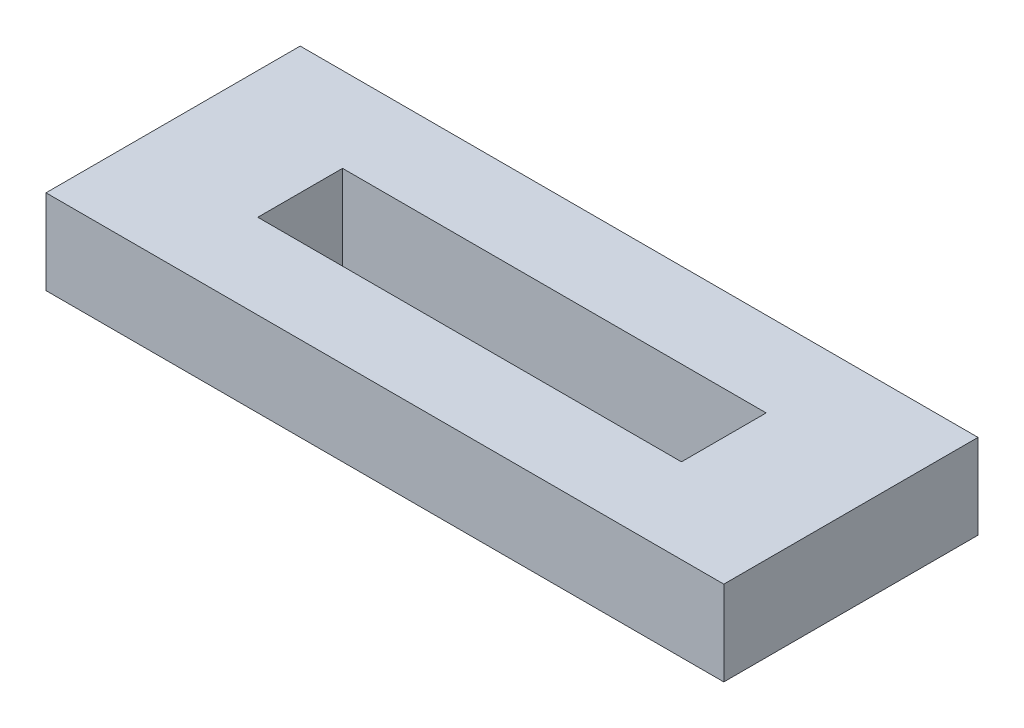
ISO-10303-21;
HEADER;
FILE_DESCRIPTION(('STEP AP214'),'2;1');
FILE_NAME('part.step','',(''),(''),'','','');
FILE_SCHEMA(('AUTOMOTIVE_DESIGN { 1 0 10303 214 1 1 1 1 }'));
ENDSEC;
DATA;
#1=APPLICATION_CONTEXT('core data for automotive mechanical design processes');
#2=APPLICATION_PROTOCOL_DEFINITION('international standard','automotive_design',2000,#1);
#3=PRODUCT_CONTEXT('',#1,'mechanical');
#4=PRODUCT('Part','Part','',(#3));
#5=PRODUCT_RELATED_PRODUCT_CATEGORY('part','',(#4));
#6=PRODUCT_DEFINITION_FORMATION('','',#4);
#7=PRODUCT_DEFINITION_CONTEXT('part definition',#1,'design');
#8=PRODUCT_DEFINITION('design','',#6,#7);
#9=PRODUCT_DEFINITION_SHAPE('','',#8);
#10=(LENGTH_UNIT() NAMED_UNIT(*) SI_UNIT(.MILLI.,.METRE.));
#11=(NAMED_UNIT(*) PLANE_ANGLE_UNIT() SI_UNIT($,.RADIAN.));
#12=(NAMED_UNIT(*) SI_UNIT($,.STERADIAN.) SOLID_ANGLE_UNIT());
#13=UNCERTAINTY_MEASURE_WITH_UNIT(LENGTH_MEASURE(1.E-05),#10,'distance_accuracy_value','');
#14=(GEOMETRIC_REPRESENTATION_CONTEXT(3) GLOBAL_UNCERTAINTY_ASSIGNED_CONTEXT((#13)) GLOBAL_UNIT_ASSIGNED_CONTEXT((#10,
#11,#12)) REPRESENTATION_CONTEXT('',''));
#15=CARTESIAN_POINT('',(0.,0.,0.));
#16=DIRECTION('',(0.,0.,1.));
#17=DIRECTION('',(1.,0.,0.));
#18=AXIS2_PLACEMENT_3D('',#15,#16,#17);
#19=CARTESIAN_POINT('',(0.,10.,0.));
#20=DIRECTION('',(0.,1.,0.));
#21=DIRECTION('',(0.,0.,1.));
#22=AXIS2_PLACEMENT_3D('',#19,#20,#21);
#23=PLANE('',#22);
#24=DIRECTION('',(0.,0.,1.));
#25=VECTOR('',#24,1.);
#26=CARTESIAN_POINT('',(-40.,10.,15.));
#27=LINE('',#26,#25);
#28=CARTESIAN_POINT('',(-40.,10.,-15.));
#29=VERTEX_POINT('',#28);
#30=CARTESIAN_POINT('',(-40.,10.,15.));
#31=VERTEX_POINT('',#30);
#32=EDGE_CURVE('E134',#29,#31,#27,.T.);
#33=ORIENTED_EDGE('',*,*,#32,.T.);
#34=DIRECTION('',(1.,0.,0.));
#35=VECTOR('',#34,1.);
#36=CARTESIAN_POINT('',(40.,10.,15.));
#37=LINE('',#36,#35);
#38=CARTESIAN_POINT('',(40.,10.,15.));
#39=VERTEX_POINT('',#38);
#40=EDGE_CURVE('E137',#31,#39,#37,.T.);
#41=ORIENTED_EDGE('',*,*,#40,.T.);
#42=DIRECTION('',(0.,0.,-1.));
#43=VECTOR('',#42,1.);
#44=CARTESIAN_POINT('',(40.,10.,15.));
#45=LINE('',#44,#43);
#46=CARTESIAN_POINT('',(40.,10.,-15.));
#47=VERTEX_POINT('',#46);
#48=EDGE_CURVE('E140',#39,#47,#45,.T.);
#49=ORIENTED_EDGE('',*,*,#48,.T.);
#50=DIRECTION('',(-1.,0.,0.));
#51=VECTOR('',#50,1.);
#52=CARTESIAN_POINT('',(40.,10.,-15.));
#53=LINE('',#52,#51);
#54=EDGE_CURVE('E142',#47,#29,#53,.T.);
#55=ORIENTED_EDGE('',*,*,#54,.T.);
#56=EDGE_LOOP('',(#33,#41,#49,#55));
#57=FACE_BOUND('',#56,.T.);
#58=DIRECTION('',(1.,0.,0.));
#59=VECTOR('',#58,1.);
#60=CARTESIAN_POINT('',(25.,10.,5.));
#61=LINE('',#60,#59);
#62=CARTESIAN_POINT('',(-25.,10.,5.00000000000001));
#63=VERTEX_POINT('',#62);
#64=CARTESIAN_POINT('',(25.,10.,5.));
#65=VERTEX_POINT('',#64);
#66=EDGE_CURVE('E106',#63,#65,#61,.T.);
#67=ORIENTED_EDGE('',*,*,#66,.F.);
#68=DIRECTION('',(0.,0.,1.));
#69=VECTOR('',#68,1.);
#70=CARTESIAN_POINT('',(-25.,10.,5.00000000000001));
#71=LINE('',#70,#69);
#72=CARTESIAN_POINT('',(-25.,10.,-4.99999999999999));
#73=VERTEX_POINT('',#72);
#74=EDGE_CURVE('E98',#73,#63,#71,.T.);
#75=ORIENTED_EDGE('',*,*,#74,.F.);
#76=DIRECTION('',(-1.,0.,0.));
#77=VECTOR('',#76,1.);
#78=CARTESIAN_POINT('',(25.,10.,-5.));
#79=LINE('',#78,#77);
#80=CARTESIAN_POINT('',(25.,10.,-5.));
#81=VERTEX_POINT('',#80);
#82=EDGE_CURVE('E120',#81,#73,#79,.T.);
#83=ORIENTED_EDGE('',*,*,#82,.F.);
#84=DIRECTION('',(0.,0.,-1.));
#85=VECTOR('',#84,1.);
#86=CARTESIAN_POINT('',(25.,10.,5.));
#87=LINE('',#86,#85);
#88=EDGE_CURVE('E118',#65,#81,#87,.T.);
#89=ORIENTED_EDGE('',*,*,#88,.F.);
#90=EDGE_LOOP('',(#67,#75,#83,#89));
#91=FACE_BOUND('',#90,.T.);
#92=ADVANCED_FACE('F33',(#57,#91),#23,.T.);
#93=CARTESIAN_POINT('',(0.,0.,0.));
#94=DIRECTION('',(0.,1.,0.));
#95=DIRECTION('',(0.,0.,1.));
#96=AXIS2_PLACEMENT_3D('',#93,#94,#95);
#97=PLANE('',#96);
#98=DIRECTION('',(0.,0.,1.));
#99=VECTOR('',#98,1.);
#100=CARTESIAN_POINT('',(-40.,0.,15.));
#101=LINE('',#100,#99);
#102=CARTESIAN_POINT('',(-40.,0.,-15.));
#103=VERTEX_POINT('',#102);
#104=CARTESIAN_POINT('',(-40.,0.,15.));
#105=VERTEX_POINT('',#104);
#106=EDGE_CURVE('E114',#103,#105,#101,.T.);
#107=ORIENTED_EDGE('',*,*,#106,.F.);
#108=DIRECTION('',(-1.,0.,0.));
#109=VECTOR('',#108,1.);
#110=CARTESIAN_POINT('',(40.,0.,-15.));
#111=LINE('',#110,#109);
#112=CARTESIAN_POINT('',(40.,0.,-15.));
#113=VERTEX_POINT('',#112);
#114=EDGE_CURVE('E138',#113,#103,#111,.T.);
#115=ORIENTED_EDGE('',*,*,#114,.F.);
#116=DIRECTION('',(0.,0.,-1.));
#117=VECTOR('',#116,1.);
#118=CARTESIAN_POINT('',(40.,0.,15.));
#119=LINE('',#118,#117);
#120=CARTESIAN_POINT('',(40.,0.,15.));
#121=VERTEX_POINT('',#120);
#122=EDGE_CURVE('E149',#121,#113,#119,.T.);
#123=ORIENTED_EDGE('',*,*,#122,.F.);
#124=DIRECTION('',(1.,0.,0.));
#125=VECTOR('',#124,1.);
#126=CARTESIAN_POINT('',(40.,0.,15.));
#127=LINE('',#126,#125);
#128=EDGE_CURVE('E147',#105,#121,#127,.T.);
#129=ORIENTED_EDGE('',*,*,#128,.F.);
#130=EDGE_LOOP('',(#107,#115,#123,#129));
#131=FACE_BOUND('',#130,.T.);
#132=DIRECTION('',(0.,0.,1.));
#133=VECTOR('',#132,1.);
#134=CARTESIAN_POINT('',(-25.,0.,5.00000000000001));
#135=LINE('',#134,#133);
#136=CARTESIAN_POINT('',(-25.,0.,-4.99999999999999));
#137=VERTEX_POINT('',#136);
#138=CARTESIAN_POINT('',(-25.,0.,5.00000000000001));
#139=VERTEX_POINT('',#138);
#140=EDGE_CURVE('E56',#137,#139,#135,.T.);
#141=ORIENTED_EDGE('',*,*,#140,.T.);
#142=DIRECTION('',(1.,0.,0.));
#143=VECTOR('',#142,1.);
#144=CARTESIAN_POINT('',(25.,0.,5.));
#145=LINE('',#144,#143);
#146=CARTESIAN_POINT('',(25.,0.,5.));
#147=VERTEX_POINT('',#146);
#148=EDGE_CURVE('E113',#139,#147,#145,.T.);
#149=ORIENTED_EDGE('',*,*,#148,.T.);
#150=DIRECTION('',(0.,0.,-1.));
#151=VECTOR('',#150,1.);
#152=CARTESIAN_POINT('',(25.,0.,5.));
#153=LINE('',#152,#151);
#154=CARTESIAN_POINT('',(25.,0.,-5.));
#155=VERTEX_POINT('',#154);
#156=EDGE_CURVE('E126',#147,#155,#153,.T.);
#157=ORIENTED_EDGE('',*,*,#156,.T.);
#158=DIRECTION('',(-1.,0.,0.));
#159=VECTOR('',#158,1.);
#160=CARTESIAN_POINT('',(25.,0.,-5.));
#161=LINE('',#160,#159);
#162=EDGE_CURVE('E107',#155,#137,#161,.T.);
#163=ORIENTED_EDGE('',*,*,#162,.T.);
#164=EDGE_LOOP('',(#141,#149,#157,#163));
#165=FACE_BOUND('',#164,.T.);
#166=ADVANCED_FACE('F167',(#131,#165),#97,.F.);
#167=CARTESIAN_POINT('',(-40.,10.,15.));
#168=DIRECTION('',(1.,0.,0.));
#169=DIRECTION('',(0.,0.,-1.));
#170=AXIS2_PLACEMENT_3D('',#167,#168,#169);
#171=PLANE('',#170);
#172=ORIENTED_EDGE('',*,*,#106,.T.);
#173=DIRECTION('',(0.,-1.,0.));
#174=VECTOR('',#173,1.);
#175=CARTESIAN_POINT('',(-40.,10.,15.));
#176=LINE('',#175,#174);
#177=EDGE_CURVE('E11',#31,#105,#176,.T.);
#178=ORIENTED_EDGE('',*,*,#177,.F.);
#179=ORIENTED_EDGE('',*,*,#32,.F.);
#180=DIRECTION('',(0.,-1.,0.));
#181=VECTOR('',#180,1.);
#182=CARTESIAN_POINT('',(-40.,10.,-15.));
#183=LINE('',#182,#181);
#184=EDGE_CURVE('E144',#29,#103,#183,.T.);
#185=ORIENTED_EDGE('',*,*,#184,.T.);
#186=EDGE_LOOP('',(#172,#178,#179,#185));
#187=FACE_BOUND('',#186,.T.);
#188=ADVANCED_FACE('F35',(#187),#171,.F.);
#189=CARTESIAN_POINT('',(40.,10.,15.));
#190=DIRECTION('',(0.,0.,-1.));
#191=DIRECTION('',(-1.,0.,0.));
#192=AXIS2_PLACEMENT_3D('',#189,#190,#191);
#193=PLANE('',#192);
#194=ORIENTED_EDGE('',*,*,#128,.T.);
#195=DIRECTION('',(0.,-1.,0.));
#196=VECTOR('',#195,1.);
#197=CARTESIAN_POINT('',(40.,10.,15.));
#198=LINE('',#197,#196);
#199=EDGE_CURVE('E41',#39,#121,#198,.T.);
#200=ORIENTED_EDGE('',*,*,#199,.F.);
#201=ORIENTED_EDGE('',*,*,#40,.F.);
#202=ORIENTED_EDGE('',*,*,#177,.T.);
#203=EDGE_LOOP('',(#194,#200,#201,#202));
#204=FACE_BOUND('',#203,.T.);
#205=ADVANCED_FACE('F177',(#204),#193,.F.);
#206=CARTESIAN_POINT('',(40.,10.,15.));
#207=DIRECTION('',(-1.,0.,0.));
#208=DIRECTION('',(0.,0.,1.));
#209=AXIS2_PLACEMENT_3D('',#206,#207,#208);
#210=PLANE('',#209);
#211=ORIENTED_EDGE('',*,*,#122,.T.);
#212=DIRECTION('',(0.,-1.,0.));
#213=VECTOR('',#212,1.);
#214=CARTESIAN_POINT('',(40.,10.,-15.));
#215=LINE('',#214,#213);
#216=EDGE_CURVE('E154',#47,#113,#215,.T.);
#217=ORIENTED_EDGE('',*,*,#216,.F.);
#218=ORIENTED_EDGE('',*,*,#48,.F.);
#219=ORIENTED_EDGE('',*,*,#199,.T.);
#220=EDGE_LOOP('',(#211,#217,#218,#219));
#221=FACE_BOUND('',#220,.T.);
#222=ADVANCED_FACE('F161',(#221),#210,.F.);
#223=CARTESIAN_POINT('',(40.,10.,-15.));
#224=DIRECTION('',(0.,0.,1.));
#225=DIRECTION('',(1.,0.,0.));
#226=AXIS2_PLACEMENT_3D('',#223,#224,#225);
#227=PLANE('',#226);
#228=ORIENTED_EDGE('',*,*,#114,.T.);
#229=ORIENTED_EDGE('',*,*,#184,.F.);
#230=ORIENTED_EDGE('',*,*,#54,.F.);
#231=ORIENTED_EDGE('',*,*,#216,.T.);
#232=EDGE_LOOP('',(#228,#229,#230,#231));
#233=FACE_BOUND('',#232,.T.);
#234=ADVANCED_FACE('F171',(#233),#227,.F.);
#235=CARTESIAN_POINT('',(-25.,10.,5.00000000000001));
#236=DIRECTION('',(1.,0.,0.));
#237=DIRECTION('',(0.,0.,-1.));
#238=AXIS2_PLACEMENT_3D('',#235,#236,#237);
#239=PLANE('',#238);
#240=ORIENTED_EDGE('',*,*,#140,.F.);
#241=DIRECTION('',(0.,-1.,0.));
#242=VECTOR('',#241,1.);
#243=CARTESIAN_POINT('',(-25.,10.,-4.99999999999999));
#244=LINE('',#243,#242);
#245=EDGE_CURVE('E102',#73,#137,#244,.T.);
#246=ORIENTED_EDGE('',*,*,#245,.F.);
#247=ORIENTED_EDGE('',*,*,#74,.T.);
#248=DIRECTION('',(0.,-1.,0.));
#249=VECTOR('',#248,1.);
#250=CARTESIAN_POINT('',(-25.,10.,5.00000000000001));
#251=LINE('',#250,#249);
#252=EDGE_CURVE('E101',#63,#139,#251,.T.);
#253=ORIENTED_EDGE('',*,*,#252,.T.);
#254=EDGE_LOOP('',(#240,#246,#247,#253));
#255=FACE_BOUND('',#254,.T.);
#256=ADVANCED_FACE('F100',(#255),#239,.T.);
#257=CARTESIAN_POINT('',(25.,10.,5.));
#258=DIRECTION('',(0.,0.,-1.));
#259=DIRECTION('',(-1.,0.,0.));
#260=AXIS2_PLACEMENT_3D('',#257,#258,#259);
#261=PLANE('',#260);
#262=ORIENTED_EDGE('',*,*,#148,.F.);
#263=ORIENTED_EDGE('',*,*,#252,.F.);
#264=ORIENTED_EDGE('',*,*,#66,.T.);
#265=DIRECTION('',(0.,-1.,0.));
#266=VECTOR('',#265,1.);
#267=CARTESIAN_POINT('',(25.,10.,5.));
#268=LINE('',#267,#266);
#269=EDGE_CURVE('E115',#65,#147,#268,.T.);
#270=ORIENTED_EDGE('',*,*,#269,.T.);
#271=EDGE_LOOP('',(#262,#263,#264,#270));
#272=FACE_BOUND('',#271,.T.);
#273=ADVANCED_FACE('F110',(#272),#261,.T.);
#274=CARTESIAN_POINT('',(25.,10.,5.));
#275=DIRECTION('',(-1.,0.,0.));
#276=DIRECTION('',(0.,0.,1.));
#277=AXIS2_PLACEMENT_3D('',#274,#275,#276);
#278=PLANE('',#277);
#279=ORIENTED_EDGE('',*,*,#156,.F.);
#280=ORIENTED_EDGE('',*,*,#269,.F.);
#281=ORIENTED_EDGE('',*,*,#88,.T.);
#282=DIRECTION('',(0.,-1.,0.));
#283=VECTOR('',#282,1.);
#284=CARTESIAN_POINT('',(25.,10.,-5.));
#285=LINE('',#284,#283);
#286=EDGE_CURVE('E48',#81,#155,#285,.T.);
#287=ORIENTED_EDGE('',*,*,#286,.T.);
#288=EDGE_LOOP('',(#279,#280,#281,#287));
#289=FACE_BOUND('',#288,.T.);
#290=ADVANCED_FACE('F200',(#289),#278,.T.);
#291=CARTESIAN_POINT('',(25.,10.,-5.));
#292=DIRECTION('',(0.,0.,1.));
#293=DIRECTION('',(1.,0.,0.));
#294=AXIS2_PLACEMENT_3D('',#291,#292,#293);
#295=PLANE('',#294);
#296=ORIENTED_EDGE('',*,*,#162,.F.);
#297=ORIENTED_EDGE('',*,*,#286,.F.);
#298=ORIENTED_EDGE('',*,*,#82,.T.);
#299=ORIENTED_EDGE('',*,*,#245,.T.);
#300=EDGE_LOOP('',(#296,#297,#298,#299));
#301=FACE_BOUND('',#300,.T.);
#302=ADVANCED_FACE('F204',(#301),#295,.T.);
#303=CLOSED_SHELL('',(#92,#166,#188,#205,#222,#234,#256,#273,#290,#302));
#304=MANIFOLD_SOLID_BREP('B2',#303);
#305=ADVANCED_BREP_SHAPE_REPRESENTATION('',(#18,#304),#14);
#306=SHAPE_DEFINITION_REPRESENTATION(#9,#305);
ENDSEC;
END-ISO-10303-21;
